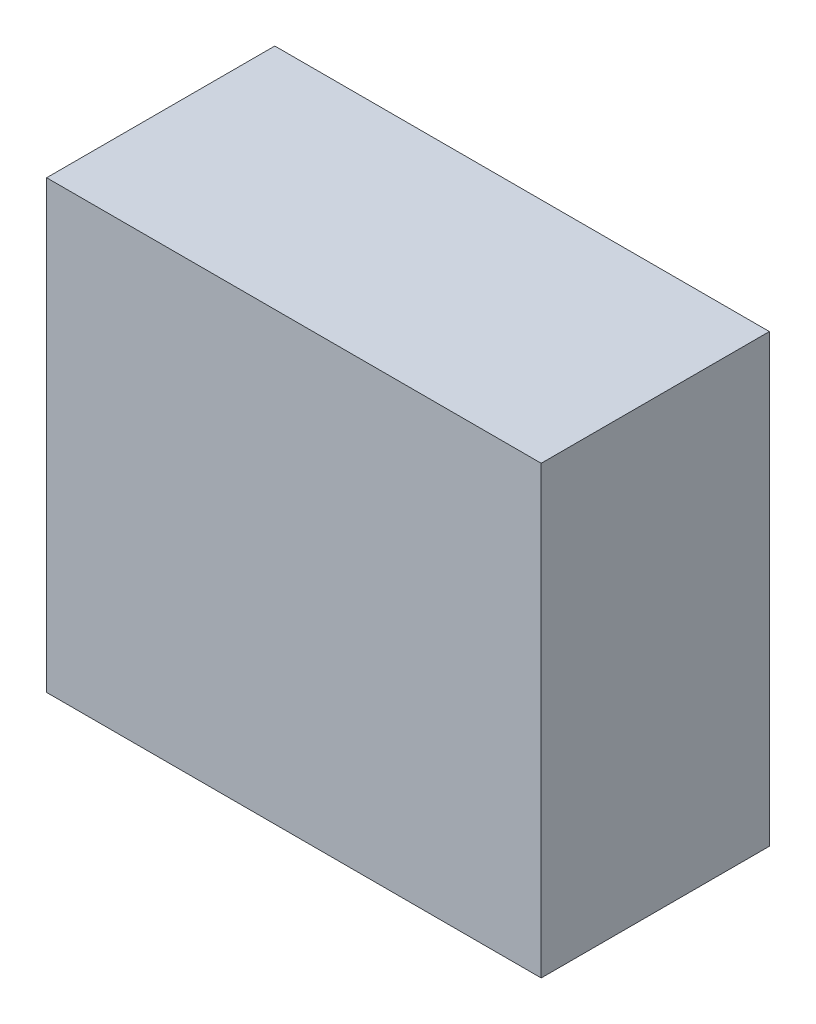
ISO-10303-21;
HEADER;
FILE_DESCRIPTION(('STEP AP214'),'2;1');
FILE_NAME('part.step','',(''),(''),'','','');
FILE_SCHEMA(('AUTOMOTIVE_DESIGN { 1 0 10303 214 1 1 1 1 }'));
ENDSEC;
DATA;
#1=APPLICATION_CONTEXT('core data for automotive mechanical design processes');
#2=APPLICATION_PROTOCOL_DEFINITION('international standard','automotive_design',2000,#1);
#3=PRODUCT_CONTEXT('',#1,'mechanical');
#4=PRODUCT('Part','Part','',(#3));
#5=PRODUCT_RELATED_PRODUCT_CATEGORY('part','',(#4));
#6=PRODUCT_DEFINITION_FORMATION('','',#4);
#7=PRODUCT_DEFINITION_CONTEXT('part definition',#1,'design');
#8=PRODUCT_DEFINITION('design','',#6,#7);
#9=PRODUCT_DEFINITION_SHAPE('','',#8);
#10=(LENGTH_UNIT() NAMED_UNIT(*) SI_UNIT(.MILLI.,.METRE.));
#11=(NAMED_UNIT(*) PLANE_ANGLE_UNIT() SI_UNIT($,.RADIAN.));
#12=(NAMED_UNIT(*) SI_UNIT($,.STERADIAN.) SOLID_ANGLE_UNIT());
#13=UNCERTAINTY_MEASURE_WITH_UNIT(LENGTH_MEASURE(1.E-05),#10,'distance_accuracy_value','');
#14=(GEOMETRIC_REPRESENTATION_CONTEXT(3) GLOBAL_UNCERTAINTY_ASSIGNED_CONTEXT((#13)) GLOBAL_UNIT_ASSIGNED_CONTEXT((#10,
#11,#12)) REPRESENTATION_CONTEXT('',''));
#15=CARTESIAN_POINT('',(0.,0.,0.));
#16=DIRECTION('',(0.,0.,1.));
#17=DIRECTION('',(1.,0.,0.));
#18=AXIS2_PLACEMENT_3D('',#15,#16,#17);
#19=CARTESIAN_POINT('',(0.175,-1.69,1.74));
#20=DIRECTION('',(0.,0.,1.));
#21=DIRECTION('',(1.,0.,0.));
#22=AXIS2_PLACEMENT_3D('',#19,#20,#21);
#23=PLANE('',#22);
#24=DIRECTION('',(0.,1.,0.));
#25=VECTOR('',#24,1.);
#26=CARTESIAN_POINT('',(3.925,-1.69,1.74));
#27=LINE('',#26,#25);
#28=CARTESIAN_POINT('',(3.925,1.69,1.74));
#29=VERTEX_POINT('',#28);
#30=CARTESIAN_POINT('',(3.925,-1.69,1.74));
#31=VERTEX_POINT('',#30);
#32=EDGE_CURVE('E75',#29,#31,#27,.F.);
#33=ORIENTED_EDGE('',*,*,#32,.F.);
#34=DIRECTION('',(1.,0.,0.));
#35=VECTOR('',#34,1.);
#36=CARTESIAN_POINT('',(0.175,1.69,1.74));
#37=LINE('',#36,#35);
#38=CARTESIAN_POINT('',(0.175,1.69,1.74));
#39=VERTEX_POINT('',#38);
#40=EDGE_CURVE('E57',#39,#29,#37,.T.);
#41=ORIENTED_EDGE('',*,*,#40,.F.);
#42=DIRECTION('',(0.,1.,0.));
#43=VECTOR('',#42,1.);
#44=CARTESIAN_POINT('',(0.175,-1.69,1.74));
#45=LINE('',#44,#43);
#46=CARTESIAN_POINT('',(0.175,-1.69,1.74));
#47=VERTEX_POINT('',#46);
#48=EDGE_CURVE('E19',#39,#47,#45,.F.);
#49=ORIENTED_EDGE('',*,*,#48,.T.);
#50=DIRECTION('',(1.,0.,0.));
#51=VECTOR('',#50,1.);
#52=CARTESIAN_POINT('',(0.175,-1.69,1.74));
#53=LINE('',#52,#51);
#54=EDGE_CURVE('E54',#47,#31,#53,.T.);
#55=ORIENTED_EDGE('',*,*,#54,.T.);
#56=EDGE_LOOP('',(#33,#41,#49,#55));
#57=FACE_BOUND('',#56,.T.);
#58=ADVANCED_FACE('F16',(#57),#23,.T.);
#59=CARTESIAN_POINT('',(0.175,-1.69,0.01));
#60=DIRECTION('',(1.,0.,0.));
#61=DIRECTION('',(0.,0.,-1.));
#62=AXIS2_PLACEMENT_3D('',#59,#60,#61);
#63=PLANE('',#62);
#64=DIRECTION('',(0.,0.,1.));
#65=VECTOR('',#64,1.);
#66=CARTESIAN_POINT('',(0.175,1.69,0.01));
#67=LINE('',#66,#65);
#68=CARTESIAN_POINT('',(0.175,1.69,0.01));
#69=VERTEX_POINT('',#68);
#70=EDGE_CURVE('E77',#69,#39,#67,.T.);
#71=ORIENTED_EDGE('',*,*,#70,.F.);
#72=DIRECTION('',(0.,1.,0.));
#73=VECTOR('',#72,1.);
#74=CARTESIAN_POINT('',(0.175,-1.69,0.01));
#75=LINE('',#74,#73);
#76=CARTESIAN_POINT('',(0.175,-1.69,0.01));
#77=VERTEX_POINT('',#76);
#78=EDGE_CURVE('E72',#69,#77,#75,.F.);
#79=ORIENTED_EDGE('',*,*,#78,.T.);
#80=DIRECTION('',(0.,0.,1.));
#81=VECTOR('',#80,1.);
#82=CARTESIAN_POINT('',(0.175,-1.69,0.01));
#83=LINE('',#82,#81);
#84=EDGE_CURVE('E62',#77,#47,#83,.T.);
#85=ORIENTED_EDGE('',*,*,#84,.T.);
#86=ORIENTED_EDGE('',*,*,#48,.F.);
#87=EDGE_LOOP('',(#71,#79,#85,#86));
#88=FACE_BOUND('',#87,.T.);
#89=ADVANCED_FACE('F71',(#88),#63,.F.);
#90=CARTESIAN_POINT('',(0.175,-1.69,0.01));
#91=DIRECTION('',(0.,1.,0.));
#92=DIRECTION('',(0.,0.,1.));
#93=AXIS2_PLACEMENT_3D('',#90,#91,#92);
#94=PLANE('',#93);
#95=ORIENTED_EDGE('',*,*,#54,.F.);
#96=ORIENTED_EDGE('',*,*,#84,.F.);
#97=DIRECTION('',(1.,0.,0.));
#98=VECTOR('',#97,1.);
#99=CARTESIAN_POINT('',(0.175,-1.69,0.01));
#100=LINE('',#99,#98);
#101=CARTESIAN_POINT('',(3.925,-1.69,0.01));
#102=VERTEX_POINT('',#101);
#103=EDGE_CURVE('E82',#77,#102,#100,.T.);
#104=ORIENTED_EDGE('',*,*,#103,.T.);
#105=DIRECTION('',(0.,0.,-1.));
#106=VECTOR('',#105,1.);
#107=CARTESIAN_POINT('',(3.925,-1.69,0.01));
#108=LINE('',#107,#106);
#109=EDGE_CURVE('E68',#31,#102,#108,.T.);
#110=ORIENTED_EDGE('',*,*,#109,.F.);
#111=EDGE_LOOP('',(#95,#96,#104,#110));
#112=FACE_BOUND('',#111,.T.);
#113=ADVANCED_FACE('F65',(#112),#94,.F.);
#114=CARTESIAN_POINT('',(3.925,-1.69,0.01));
#115=DIRECTION('',(1.,0.,0.));
#116=DIRECTION('',(0.,0.,-1.));
#117=AXIS2_PLACEMENT_3D('',#114,#115,#116);
#118=PLANE('',#117);
#119=DIRECTION('',(0.,0.,1.));
#120=VECTOR('',#119,1.);
#121=CARTESIAN_POINT('',(3.925,1.69,0.01));
#122=LINE('',#121,#120);
#123=CARTESIAN_POINT('',(3.925,1.69,0.01));
#124=VERTEX_POINT('',#123);
#125=EDGE_CURVE('E33',#29,#124,#122,.F.);
#126=ORIENTED_EDGE('',*,*,#125,.F.);
#127=ORIENTED_EDGE('',*,*,#32,.T.);
#128=ORIENTED_EDGE('',*,*,#109,.T.);
#129=DIRECTION('',(0.,1.,0.));
#130=VECTOR('',#129,1.);
#131=CARTESIAN_POINT('',(3.925,-1.69,0.01));
#132=LINE('',#131,#130);
#133=EDGE_CURVE('E25',#102,#124,#132,.T.);
#134=ORIENTED_EDGE('',*,*,#133,.T.);
#135=EDGE_LOOP('',(#126,#127,#128,#134));
#136=FACE_BOUND('',#135,.T.);
#137=ADVANCED_FACE('F87',(#136),#118,.T.);
#138=CARTESIAN_POINT('',(0.175,1.69,0.01));
#139=DIRECTION('',(0.,1.,0.));
#140=DIRECTION('',(0.,0.,1.));
#141=AXIS2_PLACEMENT_3D('',#138,#139,#140);
#142=PLANE('',#141);
#143=ORIENTED_EDGE('',*,*,#40,.T.);
#144=ORIENTED_EDGE('',*,*,#125,.T.);
#145=DIRECTION('',(1.,0.,0.));
#146=VECTOR('',#145,1.);
#147=CARTESIAN_POINT('',(0.175,1.69,0.01));
#148=LINE('',#147,#146);
#149=EDGE_CURVE('E11',#124,#69,#148,.F.);
#150=ORIENTED_EDGE('',*,*,#149,.T.);
#151=ORIENTED_EDGE('',*,*,#70,.T.);
#152=EDGE_LOOP('',(#143,#144,#150,#151));
#153=FACE_BOUND('',#152,.T.);
#154=ADVANCED_FACE('F90',(#153),#142,.T.);
#155=CARTESIAN_POINT('',(0.175,-1.69,0.01));
#156=DIRECTION('',(0.,0.,1.));
#157=DIRECTION('',(1.,0.,0.));
#158=AXIS2_PLACEMENT_3D('',#155,#156,#157);
#159=PLANE('',#158);
#160=ORIENTED_EDGE('',*,*,#133,.F.);
#161=ORIENTED_EDGE('',*,*,#103,.F.);
#162=ORIENTED_EDGE('',*,*,#78,.F.);
#163=ORIENTED_EDGE('',*,*,#149,.F.);
#164=EDGE_LOOP('',(#160,#161,#162,#163));
#165=FACE_BOUND('',#164,.T.);
#166=ADVANCED_FACE('F89',(#165),#159,.F.);
#167=CLOSED_SHELL('',(#58,#89,#113,#137,#154,#166));
#168=MANIFOLD_SOLID_BREP('B1',#167);
#169=ADVANCED_BREP_SHAPE_REPRESENTATION('',(#18,#168),#14);
#170=SHAPE_DEFINITION_REPRESENTATION(#9,#169);
ENDSEC;
END-ISO-10303-21;
